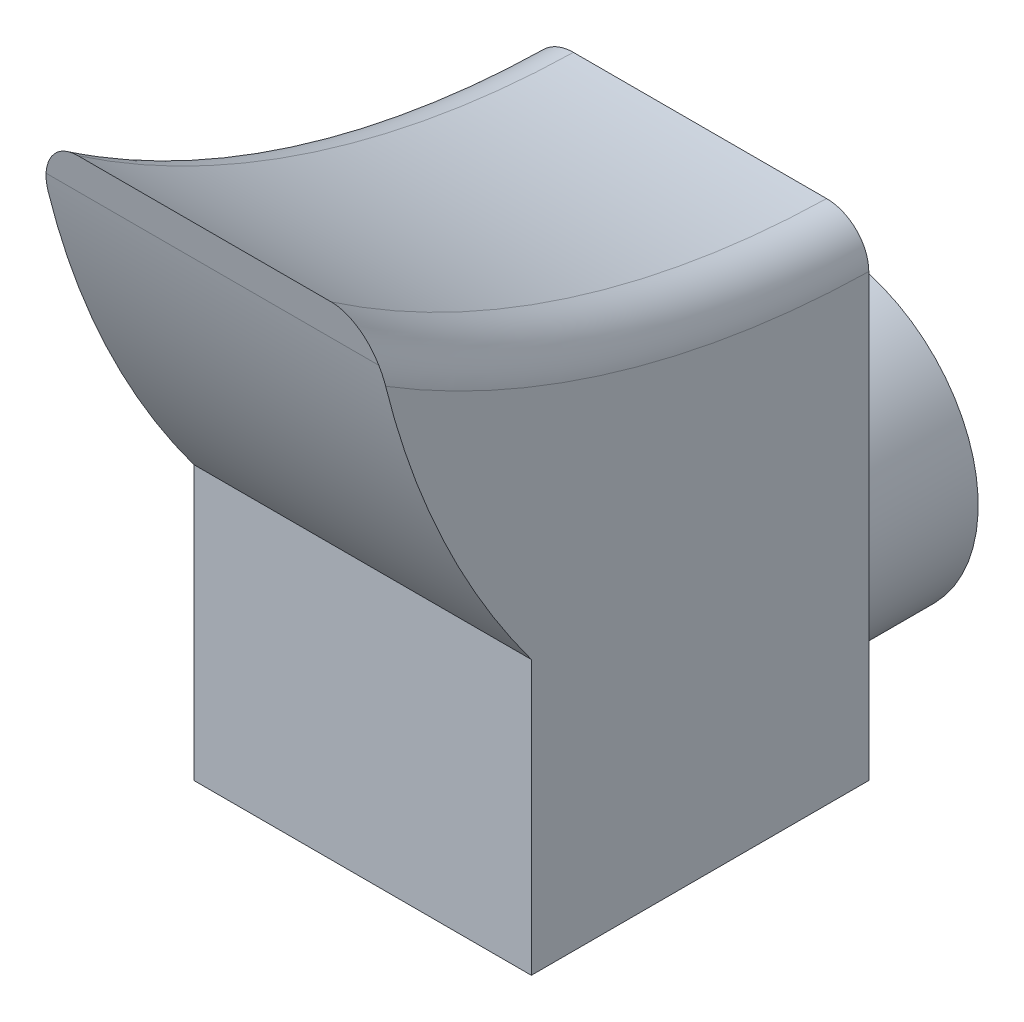
ISO-10303-21;
HEADER;
FILE_DESCRIPTION(('STEP AP214'),'2;1');
FILE_NAME('part.step','',(''),(''),'','','');
FILE_SCHEMA(('AUTOMOTIVE_DESIGN { 1 0 10303 214 1 1 1 1 }'));
ENDSEC;
DATA;
#1=APPLICATION_CONTEXT('core data for automotive mechanical design processes');
#2=APPLICATION_PROTOCOL_DEFINITION('international standard','automotive_design',2000,#1);
#3=PRODUCT_CONTEXT('',#1,'mechanical');
#4=PRODUCT('Part','Part','',(#3));
#5=PRODUCT_RELATED_PRODUCT_CATEGORY('part','',(#4));
#6=PRODUCT_DEFINITION_FORMATION('','',#4);
#7=PRODUCT_DEFINITION_CONTEXT('part definition',#1,'design');
#8=PRODUCT_DEFINITION('design','',#6,#7);
#9=PRODUCT_DEFINITION_SHAPE('','',#8);
#10=(LENGTH_UNIT() NAMED_UNIT(*) SI_UNIT(.MILLI.,.METRE.));
#11=(NAMED_UNIT(*) PLANE_ANGLE_UNIT() SI_UNIT($,.RADIAN.));
#12=(NAMED_UNIT(*) SI_UNIT($,.STERADIAN.) SOLID_ANGLE_UNIT());
#13=UNCERTAINTY_MEASURE_WITH_UNIT(LENGTH_MEASURE(1.E-05),#10,'distance_accuracy_value','');
#14=(GEOMETRIC_REPRESENTATION_CONTEXT(3) GLOBAL_UNCERTAINTY_ASSIGNED_CONTEXT((#13)) GLOBAL_UNIT_ASSIGNED_CONTEXT((#10,
#11,#12)) REPRESENTATION_CONTEXT('',''));
#15=CARTESIAN_POINT('',(0.,0.,0.));
#16=DIRECTION('',(0.,0.,1.));
#17=DIRECTION('',(1.,0.,0.));
#18=AXIS2_PLACEMENT_3D('',#15,#16,#17);
#19=CARTESIAN_POINT('',(-37.6289426981006,-5.27961884824157,-6.47017789258267));
#20=DIRECTION('',(1.,0.,0.));
#21=DIRECTION('',(0.,0.,-1.));
#22=AXIS2_PLACEMENT_3D('',#19,#20,#21);
#23=TOROIDAL_SURFACE('',#22,22.7488394669658,1.);
#24=CARTESIAN_POINT('',(-37.6289426981006,-5.27961884824157,-6.47017789258267));
#25=DIRECTION('',(1.,0.,0.));
#26=DIRECTION('',(0.,0.,-1.));
#27=AXIS2_PLACEMENT_3D('',#24,#25,#26);
#28=CIRCLE('',#27,21.7488394669658);
#29=CARTESIAN_POINT('',(-37.6289426981006,-23.2718264735297,5.74835241708936));
#30=VERTEX_POINT('',#29);
#31=CARTESIAN_POINT('',(-37.6289426981006,-27.0233754443124,-6.));
#32=VERTEX_POINT('',#31);
#33=EDGE_CURVE('E213',#30,#32,#28,.T.);
#34=ORIENTED_EDGE('',*,*,#33,.F.);
#35=CARTESIAN_POINT('',(-36.6853513464277,-24.1930807098283,5.564582235797));
#36=CARTESIAN_POINT('',(-36.6956954832154,-24.1530939389257,5.57255872681168));
#37=CARTESIAN_POINT('',(-36.7074576399678,-24.1134783416829,5.58046117675489));
#38=CARTESIAN_POINT('',(-36.7339397839073,-24.0351421802894,5.59608753700791));
#39=CARTESIAN_POINT('',(-36.7486644200734,-23.9964231309237,5.60381114515108));
#40=CARTESIAN_POINT('',(-36.7977241614413,-23.8812912484032,5.62677745139932));
#41=CARTESIAN_POINT('',(-36.8367491353526,-23.806687508289,5.64165927479366));
#42=CARTESIAN_POINT('',(-36.9150603393528,-23.6856781322502,5.66579801315328));
#43=CARTESIAN_POINT('',(-36.9511453566182,-23.6372685057656,5.67545468064511));
#44=CARTESIAN_POINT('',(-37.0303487099904,-23.546466239408,5.69356775767946));
#45=CARTESIAN_POINT('',(-37.0734426569648,-23.5040536555265,5.70202814561786));
#46=CARTESIAN_POINT('',(-37.1567741582882,-23.4356212634715,5.7156789193117));
#47=CARTESIAN_POINT('',(-37.1956688682168,-23.4080335944397,5.72118205920475));
#48=CARTESIAN_POINT('',(-37.2774966939471,-23.3594340535718,5.73087661048507));
#49=CARTESIAN_POINT('',(-37.3204197752841,-23.338406378451,5.73507117428393));
#50=CARTESIAN_POINT('',(-37.3872714486787,-23.312854948594,5.74016812875327));
#51=CARTESIAN_POINT('',(-37.4100339609895,-23.3053235052763,5.74167048787342));
#52=CARTESIAN_POINT('',(-37.4561977922691,-23.2924471401595,5.74423904263135));
#53=CARTESIAN_POINT('',(-37.4795989956189,-23.2871018253804,5.74530531666006));
#54=CARTESIAN_POINT('',(-37.5270928282021,-23.2786906095204,5.74698317126587));
#55=CARTESIAN_POINT('',(-37.5511902449682,-23.2756506124621,5.74758958455387));
#56=CARTESIAN_POINT('',(-37.5996006464316,-23.2720141449821,5.74831498071676));
#57=CARTESIAN_POINT('',(-37.6239138309342,-23.2714202440057,5.74843345104321));
#58=CARTESIAN_POINT('',(-37.6481972770766,-23.2720856800498,5.74830071102677));
#59=B_SPLINE_CURVE_WITH_KNOTS('',3,(#35,#36,#37,#38,#39,#40,#41,#42,#43,#44,#45,#46,#47,#48,#49,
#50,#51,#52,#53,#54,#55,#56,#57,#58),.UNSPECIFIED.,.F.,.F.,(4,2,2,2,2,2,2,2,2,2,2,4),(0.,
0.126130047675834,0.252459595462337,0.507564018352994,0.690453275940379,0.872719235038897,
1.01620811742699,1.1593486114008,1.23132437989295,1.3032872042798,1.37604713348774,
1.44888347222582),.UNSPECIFIED.);
#60=CARTESIAN_POINT('',(-36.6853513464277,-24.1930807098284,5.56458223579698));
#61=VERTEX_POINT('',#60);
#62=EDGE_CURVE('E11',#61,#30,#59,.T.);
#63=ORIENTED_EDGE('',*,*,#62,.F.);
#64=CARTESIAN_POINT('',(-36.6289426981006,-24.6511464936799,5.4568340456942));
#65=CARTESIAN_POINT('',(-36.6289526314642,-24.5980474215743,5.46996625931004));
#66=CARTESIAN_POINT('',(-36.6311471007758,-24.54488625115,5.48288597597736));
#67=CARTESIAN_POINT('',(-36.6399850537894,-24.4392091744385,5.50812840833854));
#68=CARTESIAN_POINT('',(-36.6465958155061,-24.3866913944412,5.52045480523274));
#69=CARTESIAN_POINT('',(-36.6643436864144,-24.2822795479123,5.54453373127975));
#70=CARTESIAN_POINT('',(-36.6754809396598,-24.2303855012848,5.5562862421555));
#71=CARTESIAN_POINT('',(-36.7025770454371,-24.1273184763144,5.57922040010935));
#72=CARTESIAN_POINT('',(-36.7185708993055,-24.0761536536633,5.5903971902003));
#73=CARTESIAN_POINT('',(-36.7370606717887,-24.0257898351934,5.60120012398042));
#74=B_SPLINE_CURVE_WITH_KNOTS('',3,(#64,#65,#66,#67,#68,#69,#70,#71,#72,#73),.UNSPECIFIED.,.F.,
.F.,(4,2,2,2,4),(0.,0.164065786092412,0.326929233461192,0.489797864305327,0.653869323068337),.UNSPECIFIED.);
#75=CARTESIAN_POINT('',(-36.6289426981006,-24.6511464936799,5.4568340456942));
#76=VERTEX_POINT('',#75);
#77=EDGE_CURVE('E54',#76,#61,#74,.T.);
#78=ORIENTED_EDGE('',*,*,#77,.F.);
#79=CARTESIAN_POINT('',(-36.6289426981006,-5.27961884824157,-6.47017789258267));
#80=DIRECTION('',(1.,0.,0.));
#81=DIRECTION('',(0.,0.,-1.));
#82=AXIS2_PLACEMENT_3D('',#79,#80,#81);
#83=CIRCLE('',#82,22.7488394669658);
#84=CARTESIAN_POINT('',(-36.6289426981006,-28.0235989274429,-6.));
#85=VERTEX_POINT('',#84);
#86=EDGE_CURVE('E232',#85,#76,#83,.F.);
#87=ORIENTED_EDGE('',*,*,#86,.F.);
#88=CARTESIAN_POINT('',(-37.6289426981006,-27.0233754443124,-6.));
#89=CARTESIAN_POINT('',(-37.600812011129,-27.0233756263667,-6.));
#90=CARTESIAN_POINT('',(-37.5726948020853,-27.0245634696765,-6.));
#91=CARTESIAN_POINT('',(-37.5166616360605,-27.0293022331406,-6.));
#92=CARTESIAN_POINT('',(-37.4887456693778,-27.0328530386002,-6.));
#93=CARTESIAN_POINT('',(-37.4056513333996,-27.0470156178454,-6.));
#94=CARTESIAN_POINT('',(-37.3510296045168,-27.0611376516988,-6.));
#95=CARTESIAN_POINT('',(-37.2449342142321,-27.0983505003268,-6.));
#96=CARTESIAN_POINT('',(-37.1934620497267,-27.1214455419726,-6.));
#97=CARTESIAN_POINT('',(-37.0951234108195,-27.175947218143,-6.));
#98=CARTESIAN_POINT('',(-37.0482564063412,-27.2073528945323,-6.));
#99=CARTESIAN_POINT('',(-36.9604531844218,-27.277590355154,-6.));
#100=CARTESIAN_POINT('',(-36.9195179453041,-27.3164233619281,-6.));
#101=CARTESIAN_POINT('',(-36.8447456514233,-27.400408853942,-6.));
#102=CARTESIAN_POINT('',(-36.8109086035056,-27.4455613452764,-6.));
#103=CARTESIAN_POINT('',(-36.7512879123474,-27.5409144351715,-6.));
#104=CARTESIAN_POINT('',(-36.7255055616776,-27.5911158422457,-6.));
#105=CARTESIAN_POINT('',(-36.6827293449269,-27.6951321938591,-6.));
#106=CARTESIAN_POINT('',(-36.6657365214538,-27.7489475662293,-6.));
#107=CARTESIAN_POINT('',(-36.6410307227123,-27.8586808357993,-6.));
#108=CARTESIAN_POINT('',(-36.6333151466731,-27.9145981392114,-6.));
#109=CARTESIAN_POINT('',(-36.6288523085016,-27.9988162039076,-6.));
#110=CARTESIAN_POINT('',(-36.6285525453465,-28.0269698524037,-6.));
#111=CARTESIAN_POINT('',(-36.6303241622451,-28.0832038280093,-6.));
#112=CARTESIAN_POINT('',(-36.6323956555693,-28.111284151552,-6.));
#113=CARTESIAN_POINT('',(-36.6356488330582,-28.1392405349512,-6.));
#114=B_SPLINE_CURVE_WITH_KNOTS('',3,(#88,#89,#90,#91,#92,#93,#94,#95,#96,#97,#98,#99,#100,#101,
#102,#103,#104,#105,#106,#107,#108,#109,#110,#111,#112,#113),.UNSPECIFIED.,.F.,.F.,(4,2,2,2,2,2,
2,2,2,2,2,2,4),(0.,0.0843402191428792,0.168676344829461,0.337061526601207,0.505526125121639,
0.673971309768351,0.842444244460172,1.01091734162779,1.1794174605053,1.34793756217307,
1.51641041012378,1.60078959852427,1.68517281773071),.UNSPECIFIED.);
#115=EDGE_CURVE('E224',#32,#85,#114,.T.);
#116=ORIENTED_EDGE('',*,*,#115,.F.);
#117=EDGE_LOOP('',(#34,#63,#78,#87,#116));
#118=FACE_BOUND('',#117,.T.);
#119=ADVANCED_FACE('F40',(#118),#23,.T.);
#120=CARTESIAN_POINT('',(-43.6334726202988,-5.27961884824157,-6.47017789258267));
#121=DIRECTION('',(-1.,0.,0.));
#122=DIRECTION('',(0.,0.,1.));
#123=AXIS2_PLACEMENT_3D('',#120,#121,#122);
#124=TOROIDAL_SURFACE('',#123,22.7488394669658,1.);
#125=CARTESIAN_POINT('',(-43.6334726202988,-5.27961884824157,-6.47017789258267));
#126=DIRECTION('',(-1.,0.,0.));
#127=DIRECTION('',(0.,0.,1.));
#128=AXIS2_PLACEMENT_3D('',#125,#126,#127);
#129=CIRCLE('',#128,21.7488394669658);
#130=CARTESIAN_POINT('',(-43.6334726202988,-27.0233754443124,-6.));
#131=VERTEX_POINT('',#130);
#132=CARTESIAN_POINT('',(-43.6334726202988,-23.2718264735297,5.74835241708936));
#133=VERTEX_POINT('',#132);
#134=EDGE_CURVE('E173',#131,#133,#129,.T.);
#135=ORIENTED_EDGE('',*,*,#134,.F.);
#136=CARTESIAN_POINT('',(-44.6334726202988,-28.0235989274429,-6.));
#137=CARTESIAN_POINT('',(-44.6334724313528,-27.9954527858812,-6.));
#138=CARTESIAN_POINT('',(-44.6322840757389,-27.9673201273077,-6.));
#139=CARTESIAN_POINT('',(-44.6275432336506,-27.9112561069032,-6.));
#140=CARTESIAN_POINT('',(-44.6239908599588,-27.8833247355335,-6.));
#141=CARTESIAN_POINT('',(-44.6098218219498,-27.8001837473611,-6.));
#142=CARTESIAN_POINT('',(-44.5956931445476,-27.7455309758849,-6.));
#143=CARTESIAN_POINT('',(-44.5584615326986,-27.6393748841817,-6.));
#144=CARTESIAN_POINT('',(-44.5353543323154,-27.5878730745445,-6.));
#145=CARTESIAN_POINT('',(-44.4808219457112,-27.4894787465743,-6.));
#146=CARTESIAN_POINT('',(-44.449397744806,-27.4425856831447,-6.));
#147=CARTESIAN_POINT('',(-44.3791230343687,-27.3547449779575,-6.));
#148=CARTESIAN_POINT('',(-44.3402727402732,-27.3137971637842,-6.));
#149=CARTESIAN_POINT('',(-44.2562481842304,-27.2390062100068,-6.));
#150=CARTESIAN_POINT('',(-44.2110739281855,-27.2051630637716,-6.));
#151=CARTESIAN_POINT('',(-44.1156940856263,-27.1455523334241,-6.));
#152=CARTESIAN_POINT('',(-44.0654898481742,-27.1197825916022,-6.));
#153=CARTESIAN_POINT('',(-43.9614688214281,-27.0770357923961,-6.));
#154=CARTESIAN_POINT('',(-43.9076516166713,-27.0600597481811,-6.));
#155=CARTESIAN_POINT('',(-43.7979389980107,-27.0353977567494,-6.));
#156=CARTESIAN_POINT('',(-43.7420450308264,-27.0277054628519,-6.));
#157=CARTESIAN_POINT('',(-43.6578644576159,-27.0232757470388,-6.));
#158=CARTESIAN_POINT('',(-43.6297236229641,-27.0229867456097,-6.));
#159=CARTESIAN_POINT('',(-43.5735161506095,-27.0247792343786,-6.));
#160=CARTESIAN_POINT('',(-43.5454495165692,-27.0268608394766,-6.));
#161=CARTESIAN_POINT('',(-43.5175072694162,-27.0301237615136,-6.));
#162=B_SPLINE_CURVE_WITH_KNOTS('',3,(#136,#137,#138,#139,#140,#141,#142,#143,#144,#145,#146,
#147,#148,#149,#150,#151,#152,#153,#154,#155,#156,#157,#158,#159,#160,#161),.UNSPECIFIED.,.F.,
.F.,(4,2,2,2,2,2,2,2,2,2,2,2,4),(0.,0.0843865636625379,0.168769101693769,0.337249012002759,
0.505809069699958,0.67434916700264,0.842884375568161,1.01141942683125,1.17990939667175,
1.34841877483147,1.51681288899526,1.60115329975909,1.68549779855797),.UNSPECIFIED.);
#163=CARTESIAN_POINT('',(-44.6334726202988,-28.0235989274429,-6.));
#164=VERTEX_POINT('',#163);
#165=EDGE_CURVE('E204',#164,#131,#162,.T.);
#166=ORIENTED_EDGE('',*,*,#165,.F.);
#167=CARTESIAN_POINT('',(-44.6334726202988,-5.27961884824157,-6.47017789258267));
#168=DIRECTION('',(-1.,0.,0.));
#169=DIRECTION('',(0.,0.,1.));
#170=AXIS2_PLACEMENT_3D('',#167,#168,#169);
#171=CIRCLE('',#170,22.7488394669658);
#172=CARTESIAN_POINT('',(-44.6334726202988,-24.6511464936799,5.4568340456942));
#173=VERTEX_POINT('',#172);
#174=EDGE_CURVE('E214',#173,#164,#171,.F.);
#175=ORIENTED_EDGE('',*,*,#174,.F.);
#176=CARTESIAN_POINT('',(-44.5770639719716,-24.193080709828,5.56458223579707));
#177=CARTESIAN_POINT('',(-44.5902987937409,-24.2452376077699,5.55294119343326));
#178=CARTESIAN_POINT('',(-44.6011400190571,-24.2979068118675,5.54096889751205));
#179=CARTESIAN_POINT('',(-44.6181153622274,-24.4034980176008,5.51652610048467));
#180=CARTESIAN_POINT('',(-44.6242811860687,-24.4564158223994,5.50405956964158));
#181=CARTESIAN_POINT('',(-44.6321631810824,-24.5624602586931,5.478630386858));
#182=CARTESIAN_POINT('',(-44.6338791186559,-24.6155869010047,5.46566770890828));
#183=CARTESIAN_POINT('',(-44.632903252869,-24.7220641540849,5.43924058354484));
#184=CARTESIAN_POINT('',(-44.6301809992322,-24.7754137860222,5.42577329434281));
#185=CARTESIAN_POINT('',(-44.6252495460348,-24.8285142087825,5.41214075302974));
#186=B_SPLINE_CURVE_WITH_KNOTS('',3,(#176,#177,#178,#179,#180,#181,#182,#183,#184,#185),
.UNSPECIFIED.,.F.,.F.,(4,2,2,2,4),(0.,0.165079415474176,0.32902908716499,0.492987365300289,
0.658075296817933),.UNSPECIFIED.);
#187=CARTESIAN_POINT('',(-44.5770639719716,-24.1930807098284,5.56458223579698));
#188=VERTEX_POINT('',#187);
#189=EDGE_CURVE('E114',#188,#173,#186,.T.);
#190=ORIENTED_EDGE('',*,*,#189,.F.);
#191=CARTESIAN_POINT('',(-43.6334726202988,-23.2718264735297,5.74835241708936));
#192=CARTESIAN_POINT('',(-43.6558893080184,-23.2718218958521,5.74835333023646));
#193=CARTESIAN_POINT('',(-43.6782918730088,-23.2728813190643,5.74814199834989));
#194=CARTESIAN_POINT('',(-43.7228755608303,-23.2770757518316,5.74730530024887));
#195=CARTESIAN_POINT('',(-43.7450568541992,-23.2802090133743,5.74668028272488));
#196=CARTESIAN_POINT('',(-43.8106143212005,-23.2925642785381,5.74421567607276));
#197=CARTESIAN_POINT('',(-43.8534403990226,-23.3047440202053,5.7417860825403));
#198=CARTESIAN_POINT('',(-43.9361707859734,-23.336007562722,5.73554968584354));
#199=CARTESIAN_POINT('',(-43.9760830040383,-23.3550717709405,5.73174679098295));
#200=CARTESIAN_POINT('',(-44.0525325984345,-23.3989353656809,5.72299695794016));
#201=CARTESIAN_POINT('',(-44.0890635169952,-23.4237454219681,5.71804789137185));
#202=CARTESIAN_POINT('',(-44.1731008061175,-23.4894407339617,5.7049431056141));
#203=CARTESIAN_POINT('',(-44.218688667515,-23.5326804497871,5.69631772284441));
#204=CARTESIAN_POINT('',(-44.3023687057512,-23.6258714683093,5.67772814171266));
#205=CARTESIAN_POINT('',(-44.3404246872876,-23.6758533273153,5.66775784803156));
#206=CARTESIAN_POINT('',(-44.3985495053812,-23.7642815808096,5.65011833492462));
#207=CARTESIAN_POINT('',(-44.4205473369952,-23.8015362347971,5.6426868418063));
#208=CARTESIAN_POINT('',(-44.461162863451,-23.8778124468193,5.62747139664544));
#209=CARTESIAN_POINT('',(-44.4797780134298,-23.9168353077662,5.61968718470025));
#210=CARTESIAN_POINT('',(-44.5134983775244,-23.9956995859167,5.60395547664164));
#211=CARTESIAN_POINT('',(-44.5286465233762,-24.0355234941936,5.59601147317825));
#212=CARTESIAN_POINT('',(-44.5558049119634,-24.1161130439402,5.57993561096382));
#213=CARTESIAN_POINT('',(-44.5678205464954,-24.1568769340268,5.5718041015756));
#214=CARTESIAN_POINT('',(-44.5783274559547,-24.1979987318176,5.56360119738549));
#215=B_SPLINE_CURVE_WITH_KNOTS('',3,(#191,#192,#193,#194,#195,#196,#197,#198,#199,#200,#201,
#202,#203,#204,#205,#206,#207,#208,#209,#210,#211,#212,#213,#214),.UNSPECIFIED.,.F.,.F.,(4,2,2,
2,2,2,2,2,2,2,2,4),(0.,0.0671974398533038,0.134338311831316,0.267331931120239,0.399950006282739,
0.532816349973668,0.722049351373787,0.912170757987285,1.0437033388368,1.17533446841467,
1.3052348640318,1.43491017153567),.UNSPECIFIED.);
#216=EDGE_CURVE('E177',#133,#188,#215,.T.);
#217=ORIENTED_EDGE('',*,*,#216,.F.);
#218=EDGE_LOOP('',(#135,#166,#175,#190,#217));
#219=FACE_BOUND('',#218,.T.);
#220=ADVANCED_FACE('F195',(#219),#124,.T.);
#221=CARTESIAN_POINT('',(-19.6334726202988,-19.6925215828526,-14.5960265837021));
#222=DIRECTION('',(-1.,0.,0.));
#223=DIRECTION('',(0.,0.,1.));
#224=AXIS2_PLACEMENT_3D('',#221,#222,#223);
#225=CYLINDRICAL_SURFACE('',#224,20.6568434284687);
#226=CARTESIAN_POINT('',(-36.6289426981006,-19.6925215828526,-14.5960265837021));
#227=DIRECTION('',(1.,0.,0.));
#228=DIRECTION('',(0.,0.,-1.));
#229=AXIS2_PLACEMENT_3D('',#226,#227,#228);
#230=CIRCLE('',#229,20.6568434284687);
#231=CARTESIAN_POINT('',(-36.6289426981006,-31.9890795741407,2.00216132929487));
#232=VERTEX_POINT('',#231);
#233=EDGE_CURVE('E154',#232,#76,#230,.F.);
#234=ORIENTED_EDGE('',*,*,#233,.T.);
#235=ORIENTED_EDGE('',*,*,#77,.T.);
#236=DIRECTION('',(-1.,0.,0.));
#237=VECTOR('',#236,1.);
#238=CARTESIAN_POINT('',(-19.6334726202988,-24.1930807098284,5.56458223579698));
#239=LINE('',#238,#237);
#240=EDGE_CURVE('E120',#61,#188,#239,.T.);
#241=ORIENTED_EDGE('',*,*,#240,.T.);
#242=ORIENTED_EDGE('',*,*,#189,.T.);
#243=CARTESIAN_POINT('',(-44.6334726202988,-19.6925215828526,-14.5960265837021));
#244=DIRECTION('',(-1.,0.,0.));
#245=DIRECTION('',(0.,0.,1.));
#246=AXIS2_PLACEMENT_3D('',#243,#244,#245);
#247=CIRCLE('',#246,20.6568434284687);
#248=CARTESIAN_POINT('',(-44.6334726202988,-31.9890795741407,2.00216132929487));
#249=VERTEX_POINT('',#248);
#250=EDGE_CURVE('E107',#173,#249,#247,.F.);
#251=ORIENTED_EDGE('',*,*,#250,.T.);
#252=DIRECTION('',(-1.,0.,0.));
#253=VECTOR('',#252,1.);
#254=CARTESIAN_POINT('',(-26.3278357448619,-31.9890795741407,2.00216132929487));
#255=LINE('',#254,#253);
#256=EDGE_CURVE('E111',#232,#249,#255,.T.);
#257=ORIENTED_EDGE('',*,*,#256,.F.);
#258=EDGE_LOOP('',(#234,#235,#241,#242,#251,#257));
#259=FACE_BOUND('',#258,.T.);
#260=ADVANCED_FACE('F110',(#259),#225,.T.);
#261=CARTESIAN_POINT('',(-44.6334726202988,0.,0.));
#262=DIRECTION('',(-1.,0.,0.));
#263=DIRECTION('',(0.,0.,1.));
#264=AXIS2_PLACEMENT_3D('',#261,#262,#263);
#265=PLANE('',#264);
#266=ORIENTED_EDGE('',*,*,#250,.F.);
#267=ORIENTED_EDGE('',*,*,#174,.T.);
#268=DIRECTION('',(0.,1.,0.));
#269=VECTOR('',#268,1.);
#270=CARTESIAN_POINT('',(-44.6334726202988,-30.5233754443124,-6.));
#271=LINE('',#270,#269);
#272=CARTESIAN_POINT('',(-44.6334726202988,-38.4758521554789,-6.));
#273=VERTEX_POINT('',#272);
#274=EDGE_CURVE('E155',#273,#164,#271,.T.);
#275=ORIENTED_EDGE('',*,*,#274,.F.);
#276=DIRECTION('',(0.,0.,1.));
#277=VECTOR('',#276,1.);
#278=CARTESIAN_POINT('',(-44.6334726202988,-38.4758521554789,0.));
#279=LINE('',#278,#277);
#280=CARTESIAN_POINT('',(-44.6334726202988,-38.4758521554789,2.00216132929487));
#281=VERTEX_POINT('',#280);
#282=EDGE_CURVE('E134',#273,#281,#279,.T.);
#283=ORIENTED_EDGE('',*,*,#282,.T.);
#284=DIRECTION('',(0.,1.,0.));
#285=VECTOR('',#284,1.);
#286=CARTESIAN_POINT('',(-44.6334726202988,0.,2.00216132929487));
#287=LINE('',#286,#285);
#288=EDGE_CURVE('E126',#281,#249,#287,.T.);
#289=ORIENTED_EDGE('',*,*,#288,.T.);
#290=EDGE_LOOP('',(#266,#267,#275,#283,#289));
#291=FACE_BOUND('',#290,.T.);
#292=ADVANCED_FACE('F132',(#291),#265,.T.);
#293=CARTESIAN_POINT('',(-36.6289426981006,0.,0.));
#294=DIRECTION('',(1.,0.,0.));
#295=DIRECTION('',(0.,0.,-1.));
#296=AXIS2_PLACEMENT_3D('',#293,#294,#295);
#297=PLANE('',#296);
#298=DIRECTION('',(0.,-1.,0.));
#299=VECTOR('',#298,1.);
#300=CARTESIAN_POINT('',(-36.6289426981006,-30.5233754443124,-6.));
#301=LINE('',#300,#299);
#302=CARTESIAN_POINT('',(-36.6289426981006,-38.4758521554789,-6.));
#303=VERTEX_POINT('',#302);
#304=EDGE_CURVE('E159',#85,#303,#301,.T.);
#305=ORIENTED_EDGE('',*,*,#304,.F.);
#306=ORIENTED_EDGE('',*,*,#86,.T.);
#307=ORIENTED_EDGE('',*,*,#233,.F.);
#308=DIRECTION('',(0.,1.,0.));
#309=VECTOR('',#308,1.);
#310=CARTESIAN_POINT('',(-36.6289426981006,0.,2.00216132929487));
#311=LINE('',#310,#309);
#312=CARTESIAN_POINT('',(-36.6289426981006,-38.4758521554789,2.00216132929487));
#313=VERTEX_POINT('',#312);
#314=EDGE_CURVE('E128',#313,#232,#311,.T.);
#315=ORIENTED_EDGE('',*,*,#314,.F.);
#316=DIRECTION('',(0.,0.,1.));
#317=VECTOR('',#316,1.);
#318=CARTESIAN_POINT('',(-36.6289426981006,-38.4758521554789,0.));
#319=LINE('',#318,#317);
#320=EDGE_CURVE('E137',#303,#313,#319,.T.);
#321=ORIENTED_EDGE('',*,*,#320,.F.);
#322=EDGE_LOOP('',(#305,#306,#307,#315,#321));
#323=FACE_BOUND('',#322,.T.);
#324=ADVANCED_FACE('F220',(#323),#297,.T.);
#325=CARTESIAN_POINT('',(0.,0.,-6.));
#326=DIRECTION('',(0.,0.,-1.));
#327=DIRECTION('',(-1.,0.,0.));
#328=AXIS2_PLACEMENT_3D('',#325,#326,#327);
#329=PLANE('',#328);
#330=CARTESIAN_POINT('',(-40.6337965997891,-34.5232195708705,-6.));
#331=DIRECTION('',(0.,0.,-1.));
#332=DIRECTION('',(-1.,0.,0.));
#333=AXIS2_PLACEMENT_3D('',#330,#331,#332);
#334=CIRCLE('',#333,3.6);
#335=CARTESIAN_POINT('',(-44.2337965997891,-34.5232195708705,-6.));
#336=VERTEX_POINT('',#335);
#337=EDGE_CURVE('E119',#336,#336,#334,.T.);
#338=ORIENTED_EDGE('',*,*,#337,.F.);
#339=EDGE_LOOP('',(#338));
#340=FACE_BOUND('',#339,.T.);
#341=DIRECTION('',(-1.,0.,0.));
#342=VECTOR('',#341,1.);
#343=CARTESIAN_POINT('',(-44.6334726202988,-27.0233754443124,-6.));
#344=LINE('',#343,#342);
#345=EDGE_CURVE('E163',#32,#131,#344,.T.);
#346=ORIENTED_EDGE('',*,*,#345,.F.);
#347=ORIENTED_EDGE('',*,*,#115,.T.);
#348=ORIENTED_EDGE('',*,*,#304,.T.);
#349=DIRECTION('',(-1.,0.,0.));
#350=VECTOR('',#349,1.);
#351=CARTESIAN_POINT('',(-44.6334726202988,-38.4758521554789,-6.));
#352=LINE('',#351,#350);
#353=EDGE_CURVE('E130',#303,#273,#352,.T.);
#354=ORIENTED_EDGE('',*,*,#353,.T.);
#355=ORIENTED_EDGE('',*,*,#274,.T.);
#356=ORIENTED_EDGE('',*,*,#165,.T.);
#357=EDGE_LOOP('',(#346,#347,#348,#354,#355,#356));
#358=FACE_BOUND('',#357,.T.);
#359=ADVANCED_FACE('F216',(#340,#358),#329,.T.);
#360=CARTESIAN_POINT('',(-24.2961447918544,-23.2718264735297,5.74835241708936));
#361=DIRECTION('',(0.,-0.195624119190526,0.980678950518941));
#362=DIRECTION('',(0.,-0.980678950518941,-0.195624119190526));
#363=AXIS2_PLACEMENT_3D('',#360,#361,#362);
#364=PLANE('',#363);
#365=ORIENTED_EDGE('',*,*,#240,.F.);
#366=ORIENTED_EDGE('',*,*,#62,.T.);
#367=DIRECTION('',(-1.,0.,0.));
#368=VECTOR('',#367,1.);
#369=CARTESIAN_POINT('',(-24.2961447918544,-23.2718264735297,5.74835241708936));
#370=LINE('',#369,#368);
#371=EDGE_CURVE('E166',#30,#133,#370,.T.);
#372=ORIENTED_EDGE('',*,*,#371,.T.);
#373=ORIENTED_EDGE('',*,*,#216,.T.);
#374=EDGE_LOOP('',(#365,#366,#372,#373));
#375=FACE_BOUND('',#374,.T.);
#376=ADVANCED_FACE('F191',(#375),#364,.T.);
#377=CARTESIAN_POINT('',(-24.2961447918544,-5.27961884824157,-6.47017789258267));
#378=DIRECTION('',(-1.,0.,0.));
#379=DIRECTION('',(0.,0.,1.));
#380=AXIS2_PLACEMENT_3D('',#377,#378,#379);
#381=CYLINDRICAL_SURFACE('',#380,21.7488394669658);
#382=ORIENTED_EDGE('',*,*,#371,.F.);
#383=ORIENTED_EDGE('',*,*,#33,.T.);
#384=ORIENTED_EDGE('',*,*,#345,.T.);
#385=ORIENTED_EDGE('',*,*,#134,.T.);
#386=EDGE_LOOP('',(#382,#383,#384,#385));
#387=FACE_BOUND('',#386,.T.);
#388=ADVANCED_FACE('F241',(#387),#381,.F.);
#389=CARTESIAN_POINT('',(-26.3278357448619,-38.4758521554789,0.));
#390=DIRECTION('',(0.,-1.,0.));
#391=DIRECTION('',(0.,0.,-1.));
#392=AXIS2_PLACEMENT_3D('',#389,#390,#391);
#393=PLANE('',#392);
#394=DIRECTION('',(-1.,0.,0.));
#395=VECTOR('',#394,1.);
#396=CARTESIAN_POINT('',(-26.3278357448619,-38.4758521554789,2.00216132929487));
#397=LINE('',#396,#395);
#398=EDGE_CURVE('E141',#313,#281,#397,.T.);
#399=ORIENTED_EDGE('',*,*,#398,.T.);
#400=ORIENTED_EDGE('',*,*,#282,.F.);
#401=ORIENTED_EDGE('',*,*,#353,.F.);
#402=ORIENTED_EDGE('',*,*,#320,.T.);
#403=EDGE_LOOP('',(#399,#400,#401,#402));
#404=FACE_BOUND('',#403,.T.);
#405=ADVANCED_FACE('F244',(#404),#393,.T.);
#406=CARTESIAN_POINT('',(-26.3278357448619,0.,2.00216132929487));
#407=DIRECTION('',(0.,0.,1.));
#408=DIRECTION('',(0.,-1.,0.));
#409=AXIS2_PLACEMENT_3D('',#406,#407,#408);
#410=PLANE('',#409);
#411=ORIENTED_EDGE('',*,*,#288,.F.);
#412=ORIENTED_EDGE('',*,*,#398,.F.);
#413=ORIENTED_EDGE('',*,*,#314,.T.);
#414=ORIENTED_EDGE('',*,*,#256,.T.);
#415=EDGE_LOOP('',(#411,#412,#413,#414));
#416=FACE_BOUND('',#415,.T.);
#417=ADVANCED_FACE('F124',(#416),#410,.T.);
#418=CARTESIAN_POINT('',(-40.6337965997891,-34.5232195708705,-9.));
#419=DIRECTION('',(0.,0.,-1.));
#420=DIRECTION('',(-1.,0.,0.));
#421=AXIS2_PLACEMENT_3D('',#418,#419,#420);
#422=PLANE('',#421);
#423=CARTESIAN_POINT('',(-40.6337965997891,-34.5232195708705,-9.));
#424=DIRECTION('',(0.,0.,-1.));
#425=DIRECTION('',(-1.,0.,0.));
#426=AXIS2_PLACEMENT_3D('',#423,#424,#425);
#427=CIRCLE('',#426,2.25);
#428=CARTESIAN_POINT('',(-42.8837965997891,-34.5232195708705,-9.));
#429=VERTEX_POINT('',#428);
#430=EDGE_CURVE('E444',#429,#429,#427,.T.);
#431=ORIENTED_EDGE('',*,*,#430,.F.);
#432=EDGE_LOOP('',(#431));
#433=FACE_BOUND('',#432,.T.);
#434=CARTESIAN_POINT('',(-40.6337965997891,-34.5232195708705,-9.));
#435=DIRECTION('',(0.,0.,-1.));
#436=DIRECTION('',(-1.,0.,0.));
#437=AXIS2_PLACEMENT_3D('',#434,#435,#436);
#438=CIRCLE('',#437,3.6);
#439=CARTESIAN_POINT('',(-44.2337965997891,-34.5232195708705,-9.));
#440=VERTEX_POINT('',#439);
#441=EDGE_CURVE('E143',#440,#440,#438,.T.);
#442=ORIENTED_EDGE('',*,*,#441,.T.);
#443=EDGE_LOOP('',(#442));
#444=FACE_BOUND('',#443,.T.);
#445=ADVANCED_FACE('F311',(#433,#444),#422,.T.);
#446=CARTESIAN_POINT('',(-40.6337965997891,-34.5232195708705,-9.));
#447=DIRECTION('',(0.,0.,1.));
#448=DIRECTION('',(1.,0.,0.));
#449=AXIS2_PLACEMENT_3D('',#446,#447,#448);
#450=CYLINDRICAL_SURFACE('',#449,3.6);
#451=ORIENTED_EDGE('',*,*,#441,.F.);
#452=EDGE_LOOP('',(#451));
#453=FACE_BOUND('',#452,.T.);
#454=ORIENTED_EDGE('',*,*,#337,.T.);
#455=EDGE_LOOP('',(#454));
#456=FACE_BOUND('',#455,.T.);
#457=ADVANCED_FACE('F303',(#453,#456),#450,.T.);
#458=CARTESIAN_POINT('',(-40.6337965997891,-34.5232195708705,6.36396103067893));
#459=DIRECTION('',(0.,0.,-1.));
#460=DIRECTION('',(-1.,0.,0.));
#461=AXIS2_PLACEMENT_3D('',#458,#459,#460);
#462=CYLINDRICAL_SURFACE('',#461,2.25);
#463=ORIENTED_EDGE('',*,*,#430,.T.);
#464=EDGE_LOOP('',(#463));
#465=FACE_BOUND('',#464,.T.);
#466=CARTESIAN_POINT('',(-40.6337965997891,-34.5232195708705,0.));
#467=DIRECTION('',(0.,0.,1.));
#468=DIRECTION('',(1.,0.,0.));
#469=AXIS2_PLACEMENT_3D('',#466,#467,#468);
#470=CIRCLE('',#469,2.25);
#471=CARTESIAN_POINT('',(-38.3837965997891,-34.5232195708705,0.));
#472=VERTEX_POINT('',#471);
#473=EDGE_CURVE('E441',#472,#472,#470,.F.);
#474=ORIENTED_EDGE('',*,*,#473,.F.);
#475=EDGE_LOOP('',(#474));
#476=FACE_BOUND('',#475,.T.);
#477=ADVANCED_FACE('F293',(#465,#476),#462,.F.);
#478=CARTESIAN_POINT('',(0.,0.,0.));
#479=DIRECTION('',(0.,0.,1.));
#480=DIRECTION('',(1.,0.,0.));
#481=AXIS2_PLACEMENT_3D('',#478,#479,#480);
#482=PLANE('',#481);
#483=ORIENTED_EDGE('',*,*,#473,.T.);
#484=EDGE_LOOP('',(#483));
#485=FACE_BOUND('',#484,.T.);
#486=ADVANCED_FACE('F222',(#485),#482,.F.);
#487=CLOSED_SHELL('',(#119,#220,#260,#292,#324,#359,#376,#388,#405,#417,#445,#457,#477,#486));
#488=MANIFOLD_SOLID_BREP('B2',#487);
#489=ADVANCED_BREP_SHAPE_REPRESENTATION('',(#18,#488),#14);
#490=SHAPE_DEFINITION_REPRESENTATION(#9,#489);
ENDSEC;
END-ISO-10303-21;
